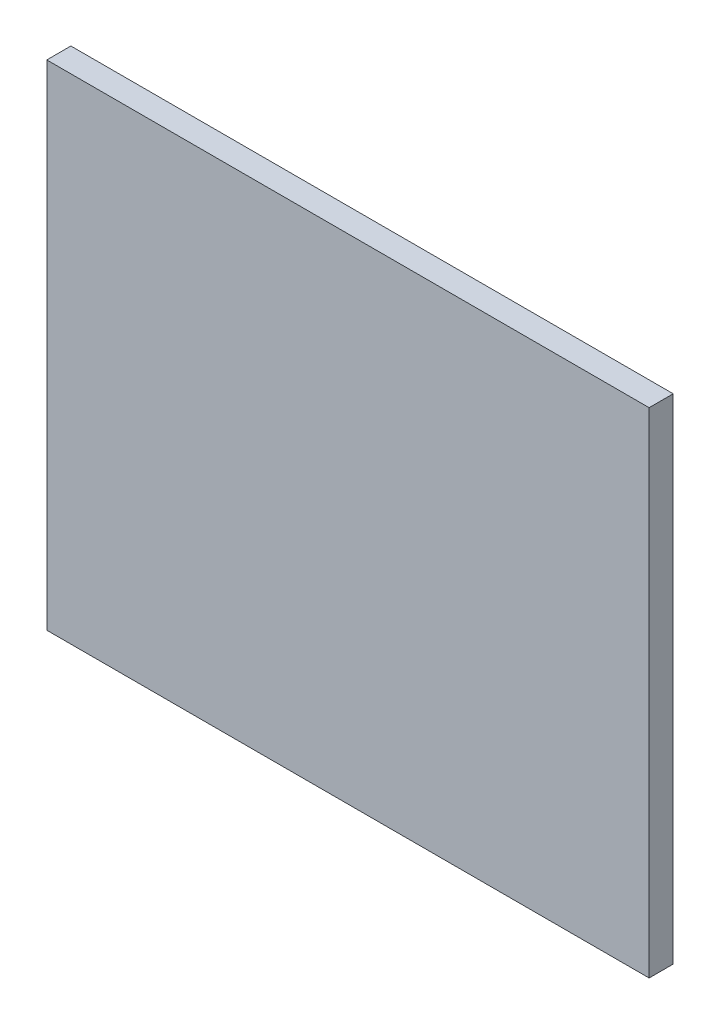
ISO-10303-21;
HEADER;
FILE_DESCRIPTION(('STEP AP214'),'2;1');
FILE_NAME('part.step','',(''),(''),'','','');
FILE_SCHEMA(('AUTOMOTIVE_DESIGN { 1 0 10303 214 1 1 1 1 }'));
ENDSEC;
DATA;
#1=APPLICATION_CONTEXT('core data for automotive mechanical design processes');
#2=APPLICATION_PROTOCOL_DEFINITION('international standard','automotive_design',2000,#1);
#3=PRODUCT_CONTEXT('',#1,'mechanical');
#4=PRODUCT('Part','Part','',(#3));
#5=PRODUCT_RELATED_PRODUCT_CATEGORY('part','',(#4));
#6=PRODUCT_DEFINITION_FORMATION('','',#4);
#7=PRODUCT_DEFINITION_CONTEXT('part definition',#1,'design');
#8=PRODUCT_DEFINITION('design','',#6,#7);
#9=PRODUCT_DEFINITION_SHAPE('','',#8);
#10=(LENGTH_UNIT() NAMED_UNIT(*) SI_UNIT(.MILLI.,.METRE.));
#11=(NAMED_UNIT(*) PLANE_ANGLE_UNIT() SI_UNIT($,.RADIAN.));
#12=(NAMED_UNIT(*) SI_UNIT($,.STERADIAN.) SOLID_ANGLE_UNIT());
#13=UNCERTAINTY_MEASURE_WITH_UNIT(LENGTH_MEASURE(1.E-05),#10,'distance_accuracy_value','');
#14=(GEOMETRIC_REPRESENTATION_CONTEXT(3) GLOBAL_UNCERTAINTY_ASSIGNED_CONTEXT((#13)) GLOBAL_UNIT_ASSIGNED_CONTEXT((#10,
#11,#12)) REPRESENTATION_CONTEXT('',''));
#15=CARTESIAN_POINT('',(0.,0.,0.));
#16=DIRECTION('',(0.,0.,1.));
#17=DIRECTION('',(1.,0.,0.));
#18=AXIS2_PLACEMENT_3D('',#15,#16,#17);
#19=CARTESIAN_POINT('',(0.,0.,20.));
#20=DIRECTION('',(1.,0.,0.));
#21=DIRECTION('',(0.,1.,0.));
#22=AXIS2_PLACEMENT_3D('',#19,#20,#21);
#23=PLANE('',#22);
#24=DIRECTION('',(0.,-1.,0.));
#25=VECTOR('',#24,1.);
#26=CARTESIAN_POINT('',(0.,0.,0.));
#27=LINE('',#26,#25);
#28=CARTESIAN_POINT('',(0.,0.,0.));
#29=VERTEX_POINT('',#28);
#30=CARTESIAN_POINT('',(0.,-410.,0.));
#31=VERTEX_POINT('',#30);
#32=EDGE_CURVE('E102',#29,#31,#27,.T.);
#33=ORIENTED_EDGE('',*,*,#32,.T.);
#34=DIRECTION('',(0.,0.,-1.));
#35=VECTOR('',#34,1.);
#36=CARTESIAN_POINT('',(0.,-410.,20.));
#37=LINE('',#36,#35);
#38=CARTESIAN_POINT('',(0.,-410.,20.));
#39=VERTEX_POINT('',#38);
#40=EDGE_CURVE('E11',#39,#31,#37,.T.);
#41=ORIENTED_EDGE('',*,*,#40,.F.);
#42=DIRECTION('',(0.,-1.,0.));
#43=VECTOR('',#42,1.);
#44=CARTESIAN_POINT('',(0.,0.,20.));
#45=LINE('',#44,#43);
#46=CARTESIAN_POINT('',(0.,0.,20.));
#47=VERTEX_POINT('',#46);
#48=EDGE_CURVE('E90',#47,#39,#45,.T.);
#49=ORIENTED_EDGE('',*,*,#48,.F.);
#50=DIRECTION('',(0.,0.,-1.));
#51=VECTOR('',#50,1.);
#52=CARTESIAN_POINT('',(0.,0.,20.));
#53=LINE('',#52,#51);
#54=EDGE_CURVE('E98',#47,#29,#53,.T.);
#55=ORIENTED_EDGE('',*,*,#54,.T.);
#56=EDGE_LOOP('',(#33,#41,#49,#55));
#57=FACE_BOUND('',#56,.T.);
#58=ADVANCED_FACE('F39',(#57),#23,.F.);
#59=CARTESIAN_POINT('',(0.,-410.,20.));
#60=DIRECTION('',(0.,1.,0.));
#61=DIRECTION('',(0.,0.,1.));
#62=AXIS2_PLACEMENT_3D('',#59,#60,#61);
#63=PLANE('',#62);
#64=DIRECTION('',(1.,0.,0.));
#65=VECTOR('',#64,1.);
#66=CARTESIAN_POINT('',(0.,-410.,0.));
#67=LINE('',#66,#65);
#68=CARTESIAN_POINT('',(500.,-410.,0.));
#69=VERTEX_POINT('',#68);
#70=EDGE_CURVE('E94',#31,#69,#67,.T.);
#71=ORIENTED_EDGE('',*,*,#70,.T.);
#72=DIRECTION('',(0.,0.,-1.));
#73=VECTOR('',#72,1.);
#74=CARTESIAN_POINT('',(500.,-410.,20.));
#75=LINE('',#74,#73);
#76=CARTESIAN_POINT('',(500.,-410.,20.));
#77=VERTEX_POINT('',#76);
#78=EDGE_CURVE('E47',#77,#69,#75,.T.);
#79=ORIENTED_EDGE('',*,*,#78,.F.);
#80=DIRECTION('',(1.,0.,0.));
#81=VECTOR('',#80,1.);
#82=CARTESIAN_POINT('',(0.,-410.,20.));
#83=LINE('',#82,#81);
#84=EDGE_CURVE('E85',#39,#77,#83,.T.);
#85=ORIENTED_EDGE('',*,*,#84,.F.);
#86=ORIENTED_EDGE('',*,*,#40,.T.);
#87=EDGE_LOOP('',(#71,#79,#85,#86));
#88=FACE_BOUND('',#87,.T.);
#89=ADVANCED_FACE('F93',(#88),#63,.F.);
#90=CARTESIAN_POINT('',(500.,0.,20.));
#91=DIRECTION('',(-1.,0.,0.));
#92=DIRECTION('',(0.,0.,1.));
#93=AXIS2_PLACEMENT_3D('',#90,#91,#92);
#94=PLANE('',#93);
#95=DIRECTION('',(0.,1.,0.));
#96=VECTOR('',#95,1.);
#97=CARTESIAN_POINT('',(500.,0.,0.));
#98=LINE('',#97,#96);
#99=CARTESIAN_POINT('',(500.,0.,0.));
#100=VERTEX_POINT('',#99);
#101=EDGE_CURVE('E72',#69,#100,#98,.T.);
#102=ORIENTED_EDGE('',*,*,#101,.T.);
#103=DIRECTION('',(0.,0.,-1.));
#104=VECTOR('',#103,1.);
#105=CARTESIAN_POINT('',(500.,0.,20.));
#106=LINE('',#105,#104);
#107=CARTESIAN_POINT('',(500.,0.,20.));
#108=VERTEX_POINT('',#107);
#109=EDGE_CURVE('E95',#108,#100,#106,.T.);
#110=ORIENTED_EDGE('',*,*,#109,.F.);
#111=DIRECTION('',(0.,1.,0.));
#112=VECTOR('',#111,1.);
#113=CARTESIAN_POINT('',(500.,0.,20.));
#114=LINE('',#113,#112);
#115=EDGE_CURVE('E88',#77,#108,#114,.T.);
#116=ORIENTED_EDGE('',*,*,#115,.F.);
#117=ORIENTED_EDGE('',*,*,#78,.T.);
#118=EDGE_LOOP('',(#102,#110,#116,#117));
#119=FACE_BOUND('',#118,.T.);
#120=ADVANCED_FACE('F96',(#119),#94,.F.);
#121=CARTESIAN_POINT('',(0.,0.,20.));
#122=DIRECTION('',(0.,-1.,0.));
#123=DIRECTION('',(0.,0.,-1.));
#124=AXIS2_PLACEMENT_3D('',#121,#122,#123);
#125=PLANE('',#124);
#126=DIRECTION('',(-1.,0.,0.));
#127=VECTOR('',#126,1.);
#128=CARTESIAN_POINT('',(0.,0.,0.));
#129=LINE('',#128,#127);
#130=EDGE_CURVE('E78',#100,#29,#129,.T.);
#131=ORIENTED_EDGE('',*,*,#130,.T.);
#132=ORIENTED_EDGE('',*,*,#54,.F.);
#133=DIRECTION('',(-1.,0.,0.));
#134=VECTOR('',#133,1.);
#135=CARTESIAN_POINT('',(0.,0.,20.));
#136=LINE('',#135,#134);
#137=EDGE_CURVE('E55',#108,#47,#136,.T.);
#138=ORIENTED_EDGE('',*,*,#137,.F.);
#139=ORIENTED_EDGE('',*,*,#109,.T.);
#140=EDGE_LOOP('',(#131,#132,#138,#139));
#141=FACE_BOUND('',#140,.T.);
#142=ADVANCED_FACE('F109',(#141),#125,.F.);
#143=CARTESIAN_POINT('',(0.,0.,20.));
#144=DIRECTION('',(0.,0.,1.));
#145=DIRECTION('',(1.,0.,0.));
#146=AXIS2_PLACEMENT_3D('',#143,#144,#145);
#147=PLANE('',#146);
#148=ORIENTED_EDGE('',*,*,#48,.T.);
#149=ORIENTED_EDGE('',*,*,#84,.T.);
#150=ORIENTED_EDGE('',*,*,#115,.T.);
#151=ORIENTED_EDGE('',*,*,#137,.T.);
#152=EDGE_LOOP('',(#148,#149,#150,#151));
#153=FACE_BOUND('',#152,.T.);
#154=ADVANCED_FACE('F86',(#153),#147,.T.);
#155=CARTESIAN_POINT('',(0.,0.,0.));
#156=DIRECTION('',(0.,0.,1.));
#157=DIRECTION('',(1.,0.,0.));
#158=AXIS2_PLACEMENT_3D('',#155,#156,#157);
#159=PLANE('',#158);
#160=ORIENTED_EDGE('',*,*,#32,.F.);
#161=ORIENTED_EDGE('',*,*,#130,.F.);
#162=ORIENTED_EDGE('',*,*,#101,.F.);
#163=ORIENTED_EDGE('',*,*,#70,.F.);
#164=EDGE_LOOP('',(#160,#161,#162,#163));
#165=FACE_BOUND('',#164,.T.);
#166=ADVANCED_FACE('F112',(#165),#159,.F.);
#167=CLOSED_SHELL('',(#58,#89,#120,#142,#154,#166));
#168=MANIFOLD_SOLID_BREP('B2',#167);
#169=ADVANCED_BREP_SHAPE_REPRESENTATION('',(#18,#168),#14);
#170=SHAPE_DEFINITION_REPRESENTATION(#9,#169);
ENDSEC;
END-ISO-10303-21;
